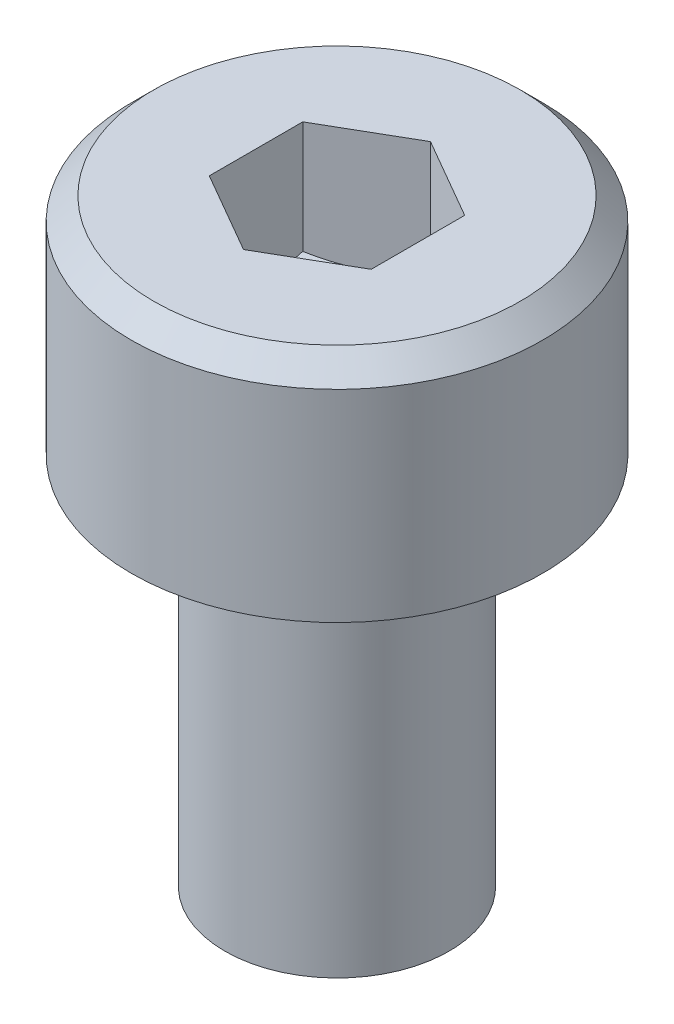
ISO-10303-21;
HEADER;
FILE_DESCRIPTION(('STEP AP214'),'2;1');
FILE_NAME('part.step','',(''),(''),'','','');
FILE_SCHEMA(('AUTOMOTIVE_DESIGN { 1 0 10303 214 1 1 1 1 }'));
ENDSEC;
DATA;
#1=APPLICATION_CONTEXT('core data for automotive mechanical design processes');
#2=APPLICATION_PROTOCOL_DEFINITION('international standard','automotive_design',2000,#1);
#3=PRODUCT_CONTEXT('',#1,'mechanical');
#4=PRODUCT('Part','Part','',(#3));
#5=PRODUCT_RELATED_PRODUCT_CATEGORY('part','',(#4));
#6=PRODUCT_DEFINITION_FORMATION('','',#4);
#7=PRODUCT_DEFINITION_CONTEXT('part definition',#1,'design');
#8=PRODUCT_DEFINITION('design','',#6,#7);
#9=PRODUCT_DEFINITION_SHAPE('','',#8);
#10=(LENGTH_UNIT() NAMED_UNIT(*) SI_UNIT(.MILLI.,.METRE.));
#11=(NAMED_UNIT(*) PLANE_ANGLE_UNIT() SI_UNIT($,.RADIAN.));
#12=(NAMED_UNIT(*) SI_UNIT($,.STERADIAN.) SOLID_ANGLE_UNIT());
#13=UNCERTAINTY_MEASURE_WITH_UNIT(LENGTH_MEASURE(1.E-05),#10,'distance_accuracy_value','');
#14=(GEOMETRIC_REPRESENTATION_CONTEXT(3) GLOBAL_UNCERTAINTY_ASSIGNED_CONTEXT((#13)) GLOBAL_UNIT_ASSIGNED_CONTEXT((#10,
#11,#12)) REPRESENTATION_CONTEXT('',''));
#15=CARTESIAN_POINT('',(0.,0.,0.));
#16=DIRECTION('',(0.,0.,1.));
#17=DIRECTION('',(1.,0.,0.));
#18=AXIS2_PLACEMENT_3D('',#15,#16,#17);
#19=CARTESIAN_POINT('',(0.,0.,0.));
#20=DIRECTION('',(0.,1.,0.));
#21=DIRECTION('',(0.,0.,1.));
#22=AXIS2_PLACEMENT_3D('',#19,#20,#21);
#23=PLANE('',#22);
#24=CARTESIAN_POINT('',(0.,0.,0.));
#25=DIRECTION('',(0.,1.,0.));
#26=DIRECTION('',(0.,0.,1.));
#27=AXIS2_PLACEMENT_3D('',#24,#25,#26);
#28=CIRCLE('',#27,2.75);
#29=CARTESIAN_POINT('',(0.,0.,2.75));
#30=VERTEX_POINT('',#29);
#31=EDGE_CURVE('E199',#30,#30,#28,.T.);
#32=ORIENTED_EDGE('',*,*,#31,.F.);
#33=EDGE_LOOP('',(#32));
#34=FACE_BOUND('',#33,.T.);
#35=CARTESIAN_POINT('',(0.,0.,0.));
#36=DIRECTION('',(0.,1.,0.));
#37=DIRECTION('',(0.,0.,1.));
#38=AXIS2_PLACEMENT_3D('',#35,#36,#37);
#39=CIRCLE('',#38,1.5);
#40=CARTESIAN_POINT('',(0.,0.,1.5));
#41=VERTEX_POINT('',#40);
#42=EDGE_CURVE('E11',#41,#41,#39,.F.);
#43=ORIENTED_EDGE('',*,*,#42,.F.);
#44=EDGE_LOOP('',(#43));
#45=FACE_BOUND('',#44,.T.);
#46=ADVANCED_FACE('F33',(#34,#45),#23,.F.);
#47=CARTESIAN_POINT('',(0.,3.,0.));
#48=DIRECTION('',(0.,1.,0.));
#49=DIRECTION('',(0.,0.,1.));
#50=AXIS2_PLACEMENT_3D('',#47,#48,#49);
#51=PLANE('',#50);
#52=CARTESIAN_POINT('',(0.,3.,0.));
#53=DIRECTION('',(0.,1.,0.));
#54=DIRECTION('',(0.,0.,1.));
#55=AXIS2_PLACEMENT_3D('',#52,#53,#54);
#56=CIRCLE('',#55,2.45);
#57=CARTESIAN_POINT('',(0.,3.,2.45));
#58=VERTEX_POINT('',#57);
#59=EDGE_CURVE('E106',#58,#58,#56,.T.);
#60=ORIENTED_EDGE('',*,*,#59,.T.);
#61=EDGE_LOOP('',(#60));
#62=FACE_BOUND('',#61,.T.);
#63=DIRECTION('',(-0.866025403784438,0.,0.500000000000001));
#64=VECTOR('',#63,1.);
#65=CARTESIAN_POINT('',(0.,3.,-1.25));
#66=LINE('',#65,#64);
#67=CARTESIAN_POINT('',(0.,3.,-1.25));
#68=VERTEX_POINT('',#67);
#69=CARTESIAN_POINT('',(-1.08253175473055,3.,-0.624999999999998));
#70=VERTEX_POINT('',#69);
#71=EDGE_CURVE('E175',#68,#70,#66,.T.);
#72=ORIENTED_EDGE('',*,*,#71,.F.);
#73=DIRECTION('',(-0.866025403784442,0.,-0.499999999999995));
#74=VECTOR('',#73,1.);
#75=CARTESIAN_POINT('',(1.08253175473054,3.,-0.625000000000013));
#76=LINE('',#75,#74);
#77=CARTESIAN_POINT('',(1.08253175473054,3.,-0.625000000000013));
#78=VERTEX_POINT('',#77);
#79=EDGE_CURVE('E173',#78,#68,#76,.T.);
#80=ORIENTED_EDGE('',*,*,#79,.F.);
#81=DIRECTION('',(0.,0.,-1.));
#82=VECTOR('',#81,1.);
#83=CARTESIAN_POINT('',(1.08253175473055,3.,0.62499999999999));
#84=LINE('',#83,#82);
#85=CARTESIAN_POINT('',(1.08253175473055,3.,0.62499999999999));
#86=VERTEX_POINT('',#85);
#87=EDGE_CURVE('E184',#86,#78,#84,.T.);
#88=ORIENTED_EDGE('',*,*,#87,.F.);
#89=DIRECTION('',(0.866025403784435,0.,-0.500000000000007));
#90=VECTOR('',#89,1.);
#91=CARTESIAN_POINT('',(0.,3.,1.25));
#92=LINE('',#91,#90);
#93=CARTESIAN_POINT('',(0.,3.,1.25));
#94=VERTEX_POINT('',#93);
#95=EDGE_CURVE('E181',#94,#86,#92,.T.);
#96=ORIENTED_EDGE('',*,*,#95,.F.);
#97=DIRECTION('',(0.866025403784441,0.,0.499999999999995));
#98=VECTOR('',#97,1.);
#99=CARTESIAN_POINT('',(-1.08253175473055,3.,0.625000000000005));
#100=LINE('',#99,#98);
#101=CARTESIAN_POINT('',(-1.08253175473055,3.,0.625000000000005));
#102=VERTEX_POINT('',#101);
#103=EDGE_CURVE('E179',#102,#94,#100,.T.);
#104=ORIENTED_EDGE('',*,*,#103,.F.);
#105=DIRECTION('',(0.,0.,1.));
#106=VECTOR('',#105,1.);
#107=CARTESIAN_POINT('',(-1.08253175473055,3.,-0.624999999999998));
#108=LINE('',#107,#106);
#109=EDGE_CURVE('E177',#70,#102,#108,.T.);
#110=ORIENTED_EDGE('',*,*,#109,.F.);
#111=EDGE_LOOP('',(#72,#80,#88,#96,#104,#110));
#112=FACE_BOUND('',#111,.T.);
#113=ADVANCED_FACE('F166',(#62,#112),#51,.T.);
#114=CARTESIAN_POINT('',(0.,3.,0.));
#115=DIRECTION('',(0.,-1.,0.));
#116=DIRECTION('',(0.,0.,-1.));
#117=AXIS2_PLACEMENT_3D('',#114,#115,#116);
#118=CYLINDRICAL_SURFACE('',#117,2.75);
#119=CARTESIAN_POINT('',(0.,2.7,0.));
#120=DIRECTION('',(0.,1.,0.));
#121=DIRECTION('',(0.,0.,1.));
#122=AXIS2_PLACEMENT_3D('',#119,#120,#121);
#123=CIRCLE('',#122,2.75);
#124=CARTESIAN_POINT('',(0.,2.7,2.75));
#125=VERTEX_POINT('',#124);
#126=EDGE_CURVE('E104',#125,#125,#123,.F.);
#127=ORIENTED_EDGE('',*,*,#126,.T.);
#128=EDGE_LOOP('',(#127));
#129=FACE_BOUND('',#128,.T.);
#130=ORIENTED_EDGE('',*,*,#31,.T.);
#131=EDGE_LOOP('',(#130));
#132=FACE_BOUND('',#131,.T.);
#133=ADVANCED_FACE('F164',(#129,#132),#118,.T.);
#134=CARTESIAN_POINT('',(1.08253175473054,3.,-0.625000000000013));
#135=DIRECTION('',(-0.499999999999995,0.,0.866025403784441));
#136=DIRECTION('',(0.866025403784442,0.,0.499999999999995));
#137=AXIS2_PLACEMENT_3D('',#134,#135,#136);
#138=PLANE('',#137);
#139=CARTESIAN_POINT('',(1.08273175473054,1.50006667590342,-0.624884529946175));
#140=CARTESIAN_POINT('',(1.03515766458485,1.48419969883568,-0.652351443698243));
#141=CARTESIAN_POINT('',(0.987172923048572,1.46976867734377,-0.680055447141205));
#142=CARTESIAN_POINT('',(0.890372341195807,1.4445778432912,-0.73594328913161));
#143=CARTESIAN_POINT('',(0.841554779441903,1.43382694464009,-0.764128121551408));
#144=CARTESIAN_POINT('',(0.744524728912284,1.41708976958857,-0.820148447344165));
#145=CARTESIAN_POINT('',(0.696327179016163,1.41099212955573,-0.847975315750971));
#146=CARTESIAN_POINT('',(0.599705015442131,1.4037096412981,-0.903760147900121));
#147=CARTESIAN_POINT('',(0.551280753523415,1.40251876590461,-0.9317179085542));
#148=CARTESIAN_POINT('',(0.460778854483859,1.40498149929693,-0.98396920432686));
#149=CARTESIAN_POINT('',(0.418687745987484,1.40803041906954,-1.00827051714773));
#150=CARTESIAN_POINT('',(0.33477978362905,1.41769827479339,-1.05671480180253));
#151=CARTESIAN_POINT('',(0.292963220509233,1.42432052094983,-1.08085760577634));
#152=CARTESIAN_POINT('',(0.208881919120999,1.44087742167282,-1.12940196776665));
#153=CARTESIAN_POINT('',(0.16662783573654,1.45088233834795,-1.15379737418302));
#154=CARTESIAN_POINT('',(0.0827502828402637,1.47359025454659,-1.20222410192666));
#155=CARTESIAN_POINT('',(0.0411257367254728,1.48628791017462,-1.22625604483093));
#156=CARTESIAN_POINT('',(-0.000199999999999905,1.50006667590342,-1.25011547005384));
#157=B_SPLINE_CURVE_WITH_KNOTS('',3,(#139,#140,#141,#142,#143,#144,#145,#146,#147,#148,#149,
#150,#151,#152,#153,#154,#155,#156),.UNSPECIFIED.,.F.,.F.,(4,2,2,2,2,2,2,2,4),(0.,
0.171605763716155,0.343624293550985,0.511384355635629,0.678938290005964,0.824893722874594,
0.970984596482971,1.12031822040934,1.26935821111451),.UNSPECIFIED.);
#158=CARTESIAN_POINT('',(1.08253175473054,1.5,-0.625000000000012));
#159=VERTEX_POINT('',#158);
#160=CARTESIAN_POINT('',(0.,1.50000000000001,-1.25));
#161=VERTEX_POINT('',#160);
#162=EDGE_CURVE('E99',#159,#161,#157,.T.);
#163=ORIENTED_EDGE('',*,*,#162,.F.);
#164=DIRECTION('',(0.,-1.,0.));
#165=VECTOR('',#164,1.);
#166=CARTESIAN_POINT('',(1.08253175473054,3.,-0.625000000000013));
#167=LINE('',#166,#165);
#168=EDGE_CURVE('E186',#78,#159,#167,.T.);
#169=ORIENTED_EDGE('',*,*,#168,.F.);
#170=ORIENTED_EDGE('',*,*,#79,.T.);
#171=DIRECTION('',(0.,-1.,0.));
#172=VECTOR('',#171,1.);
#173=CARTESIAN_POINT('',(0.,3.,-1.25));
#174=LINE('',#173,#172);
#175=EDGE_CURVE('E197',#68,#161,#174,.T.);
#176=ORIENTED_EDGE('',*,*,#175,.T.);
#177=EDGE_LOOP('',(#163,#169,#170,#176));
#178=FACE_BOUND('',#177,.T.);
#179=ADVANCED_FACE('F160',(#178),#138,.T.);
#180=CARTESIAN_POINT('',(0.,3.,-1.25));
#181=DIRECTION('',(0.500000000000001,0.,0.866025403784438));
#182=DIRECTION('',(0.866025403784438,0.,-0.500000000000001));
#183=AXIS2_PLACEMENT_3D('',#180,#181,#182);
#184=PLANE('',#183);
#185=CARTESIAN_POINT('',(0.000199999999999962,1.50006667590342,-1.25011547005384));
#186=CARTESIAN_POINT('',(-0.0473740901456956,1.48419969883569,-1.22264855630177));
#187=CARTESIAN_POINT('',(-0.0953588316819688,1.46976867734377,-1.19494455285881));
#188=CARTESIAN_POINT('',(-0.192159413534733,1.4445778432912,-1.1390567108684));
#189=CARTESIAN_POINT('',(-0.240976975288638,1.4338269446401,-1.1108718784486));
#190=CARTESIAN_POINT('',(-0.338007025818256,1.41708976958857,-1.05485155265584));
#191=CARTESIAN_POINT('',(-0.386204575714378,1.41099212955573,-1.02702468424904));
#192=CARTESIAN_POINT('',(-0.482826739288409,1.40370964129811,-0.971239852099887));
#193=CARTESIAN_POINT('',(-0.531251001207125,1.40251876590462,-0.943282091445807));
#194=CARTESIAN_POINT('',(-0.621752900246681,1.40498149929693,-0.891030795673147));
#195=CARTESIAN_POINT('',(-0.663844008743058,1.40803041906954,-0.866729482852274));
#196=CARTESIAN_POINT('',(-0.747751971101493,1.41769827479339,-0.818285198197478));
#197=CARTESIAN_POINT('',(-0.789568534221311,1.42432052094984,-0.794142394223667));
#198=CARTESIAN_POINT('',(-0.873649835609546,1.44087742167282,-0.745598032233355));
#199=CARTESIAN_POINT('',(-0.915903918994006,1.45088233834796,-0.721202625816976));
#200=CARTESIAN_POINT('',(-0.999781471890284,1.47359025454659,-0.672775898073342));
#201=CARTESIAN_POINT('',(-1.04140601800508,1.48628791017462,-0.648743955169071));
#202=CARTESIAN_POINT('',(-1.08273175473055,1.50006667590343,-0.62488452994616));
#203=B_SPLINE_CURVE_WITH_KNOTS('',3,(#185,#186,#187,#188,#189,#190,#191,#192,#193,#194,#195,
#196,#197,#198,#199,#200,#201,#202),.UNSPECIFIED.,.F.,.F.,(4,2,2,2,2,2,2,2,4),(0.,
0.171605763716156,0.343624293550986,0.511384355635631,0.678938290005966,0.824893722874599,
0.97098459648298,1.12031822040935,1.26935821111453),.UNSPECIFIED.);
#204=CARTESIAN_POINT('',(-1.08253175473055,1.50000000000001,-0.624999999999998));
#205=VERTEX_POINT('',#204);
#206=EDGE_CURVE('E48',#161,#205,#203,.T.);
#207=ORIENTED_EDGE('',*,*,#206,.F.);
#208=ORIENTED_EDGE('',*,*,#175,.F.);
#209=ORIENTED_EDGE('',*,*,#71,.T.);
#210=DIRECTION('',(0.,-1.,0.));
#211=VECTOR('',#210,1.);
#212=CARTESIAN_POINT('',(-1.08253175473055,3.,-0.624999999999998));
#213=LINE('',#212,#211);
#214=EDGE_CURVE('E195',#70,#205,#213,.T.);
#215=ORIENTED_EDGE('',*,*,#214,.T.);
#216=EDGE_LOOP('',(#207,#208,#209,#215));
#217=FACE_BOUND('',#216,.T.);
#218=ADVANCED_FACE('F156',(#217),#184,.T.);
#219=CARTESIAN_POINT('',(-1.08253175473055,3.,-0.624999999999998));
#220=DIRECTION('',(1.,0.,0.));
#221=DIRECTION('',(0.,0.,-1.));
#222=AXIS2_PLACEMENT_3D('',#219,#220,#221);
#223=PLANE('',#222);
#224=CARTESIAN_POINT('',(-1.08253175473055,1.90252350786926,-1.61854207246461));
#225=CARTESIAN_POINT('',(-1.08253175473055,1.88009544131824,-1.57179464085444));
#226=CARTESIAN_POINT('',(-1.08253175473055,1.85790094000288,-1.52493329892675));
#227=CARTESIAN_POINT('',(-1.08253175473055,1.81410999015528,-1.43092215197583));
#228=CARTESIAN_POINT('',(-1.08253175473055,1.79251364925216,-1.38377229687903));
#229=CARTESIAN_POINT('',(-1.08253175473055,1.74992928980642,-1.28885313779535));
#230=CARTESIAN_POINT('',(-1.08253175473055,1.72894575604473,-1.24108181117268));
#231=CARTESIAN_POINT('',(-1.08253175473055,1.68792455230513,-1.14513807265409));
#232=CARTESIAN_POINT('',(-1.08253175473055,1.66788683314613,-1.09696568176655));
#233=CARTESIAN_POINT('',(-1.08253175473055,1.60851588060937,-0.949204485361103));
#234=CARTESIAN_POINT('',(-1.08253175473055,1.57106281672989,-0.848845236643131));
#235=CARTESIAN_POINT('',(-1.08253175473055,1.5044105529158,-0.645546768971506));
#236=CARTESIAN_POINT('',(-1.08253175473055,1.47518992457583,-0.5426150217241));
#237=CARTESIAN_POINT('',(-1.08253175473055,1.44130046861876,-0.386139180919494));
#238=CARTESIAN_POINT('',(-1.08253175473055,1.4316652692718,-0.333684130872886));
#239=CARTESIAN_POINT('',(-1.08253175473055,1.41636624946538,-0.228185609990205));
#240=CARTESIAN_POINT('',(-1.08253175473055,1.41070216063044,-0.175142179164228));
#241=CARTESIAN_POINT('',(-1.08253175473055,1.40387007607295,-0.0693968587056928));
#242=CARTESIAN_POINT('',(-1.08253175473055,1.40264902325599,-0.0166984916759359));
#243=CARTESIAN_POINT('',(-1.08253175473055,1.40466463647557,0.0886110877016726));
#244=CARTESIAN_POINT('',(-1.08253175473055,1.40790157853585,0.141222294450917));
#245=CARTESIAN_POINT('',(-1.08253175473055,1.42110336503279,0.271032685537224));
#246=CARTESIAN_POINT('',(-1.08253175473055,1.43354225882011,0.347980337358009));
#247=CARTESIAN_POINT('',(-1.08253175473055,1.46561869386202,0.500379188409627));
#248=CARTESIAN_POINT('',(-1.08253175473055,1.48526491121432,0.575828468041697));
#249=CARTESIAN_POINT('',(-1.08253175473054,1.51882512576911,0.688671442644939));
#250=CARTESIAN_POINT('',(-1.08253175473054,1.53085020008398,0.726648298182656));
#251=CARTESIAN_POINT('',(-1.08253175473054,1.55601332526106,0.802206178821472));
#252=CARTESIAN_POINT('',(-1.08253175473054,1.56915068154238,0.839787434712231));
#253=CARTESIAN_POINT('',(-1.08253175473054,1.60994146726917,0.952015424139686));
#254=CARTESIAN_POINT('',(-1.08253175473054,1.63897715411134,1.02615785086023));
#255=CARTESIAN_POINT('',(-1.08253175473054,1.71656734651969,1.21475992203258));
#256=CARTESIAN_POINT('',(-1.08253175473054,1.76692297933719,1.32846794126584));
#257=CARTESIAN_POINT('',(-1.08253175473054,1.87117425805083,1.55425445584888));
#258=CARTESIAN_POINT('',(-1.08253175473054,1.92507081201544,1.66633252412685));
#259=CARTESIAN_POINT('',(-1.08253175473054,2.03513914727263,1.88953187968015));
#260=CARTESIAN_POINT('',(-1.08253175473054,2.09131364415462,2.00065182135724));
#261=CARTESIAN_POINT('',(-1.08253175473054,2.20510311911809,2.22213017446064));
#262=CARTESIAN_POINT('',(-1.08253175473054,2.2627179140965,2.33248868043392));
#263=CARTESIAN_POINT('',(-1.08253175473054,2.37345842581076,2.54228730867523));
#264=CARTESIAN_POINT('',(-1.08253175473054,2.42649457284346,2.64177481780018));
#265=CARTESIAN_POINT('',(-1.08253175473054,2.53317091864402,2.84042980269941));
#266=CARTESIAN_POINT('',(-1.08253175473054,2.58681113976642,2.93959726645413));
#267=CARTESIAN_POINT('',(-1.08253175473054,2.69440737306942,3.13743371392053));
#268=CARTESIAN_POINT('',(-1.08253175473054,2.74836223499422,3.23610332396277));
#269=CARTESIAN_POINT('',(-1.08253175473053,2.85662312522996,3.43324305841481));
#270=CARTESIAN_POINT('',(-1.08253175473053,2.91092913501566,3.53171319299399));
#271=CARTESIAN_POINT('',(-1.08253175473053,2.96536388196108,3.63011165909539));
#272=B_SPLINE_CURVE_WITH_KNOTS('',3,(#224,#225,#226,#227,#228,#229,#230,#231,#232,#233,#234,
#235,#236,#237,#238,#239,#240,#241,#242,#243,#244,#245,#246,#247,#248,#249,#250,#251,#252,#253,
#254,#255,#256,#257,#258,#259,#260,#261,#262,#263,#264,#265,#266,#267,#268,#269,#270,#271),
.UNSPECIFIED.,.F.,.F.,(4,2,2,2,2,2,2,2,2,2,2,2,2,2,2,2,2,2,2,2,2,2,2,4),(0.,0.155549357752409,
0.311126524581653,0.467647428018342,0.624160183591729,0.945346442146275,1.26568878601192,
1.42556175036804,1.5854239091523,1.74337066955758,1.90132720992359,2.13468710797687,
2.36832884889941,2.48782113055145,2.60723933620812,2.8460397787221,3.21900420758858,
3.59206465930033,3.96558373159632,4.33905555802568,4.67727675927078,5.01551051822605,
5.35288396719669,5.69023976052412),.UNSPECIFIED.);
#273=CARTESIAN_POINT('',(-1.08253175473055,1.50000000000001,0.625000000000005));
#274=VERTEX_POINT('',#273);
#275=EDGE_CURVE('E56',#205,#274,#272,.T.);
#276=ORIENTED_EDGE('',*,*,#275,.F.);
#277=ORIENTED_EDGE('',*,*,#214,.F.);
#278=ORIENTED_EDGE('',*,*,#109,.T.);
#279=DIRECTION('',(0.,-1.,0.));
#280=VECTOR('',#279,1.);
#281=CARTESIAN_POINT('',(-1.08253175473055,3.,0.625000000000005));
#282=LINE('',#281,#280);
#283=EDGE_CURVE('E193',#102,#274,#282,.T.);
#284=ORIENTED_EDGE('',*,*,#283,.T.);
#285=EDGE_LOOP('',(#276,#277,#278,#284));
#286=FACE_BOUND('',#285,.T.);
#287=ADVANCED_FACE('F153',(#286),#223,.T.);
#288=CARTESIAN_POINT('',(-1.08253175473055,3.,0.625000000000005));
#289=DIRECTION('',(0.499999999999995,0.,-0.866025403784441));
#290=DIRECTION('',(-0.866025403784441,0.,-0.499999999999995));
#291=AXIS2_PLACEMENT_3D('',#288,#289,#290);
#292=PLANE('',#291);
#293=CARTESIAN_POINT('',(-1.08273175473055,1.50006667590343,0.624884529946167));
#294=CARTESIAN_POINT('',(-1.03515766458485,1.48419969883569,0.652351443698236));
#295=CARTESIAN_POINT('',(-0.987172923048576,1.46976867734378,0.680055447141197));
#296=CARTESIAN_POINT('',(-0.890372341195811,1.44457784329121,0.735943289131603));
#297=CARTESIAN_POINT('',(-0.841554779441906,1.4338269446401,0.7641281215514));
#298=CARTESIAN_POINT('',(-0.744524728912287,1.41708976958858,0.820148447344158));
#299=CARTESIAN_POINT('',(-0.696327179016165,1.41099212955574,0.847975315750964));
#300=CARTESIAN_POINT('',(-0.599705015442133,1.40370964129811,0.903760147900115));
#301=CARTESIAN_POINT('',(-0.551280753523417,1.40251876590462,0.931717908554194));
#302=CARTESIAN_POINT('',(-0.460778854483861,1.40498149929693,0.983969204326854));
#303=CARTESIAN_POINT('',(-0.418687745987484,1.40803041906954,1.00827051714773));
#304=CARTESIAN_POINT('',(-0.334779783629048,1.41769827479339,1.05671480180252));
#305=CARTESIAN_POINT('',(-0.29296322050923,1.42432052094984,1.08085760577633));
#306=CARTESIAN_POINT('',(-0.208881919120995,1.44087742167282,1.12940196776664));
#307=CARTESIAN_POINT('',(-0.166627835736535,1.45088233834795,1.15379737418302));
#308=CARTESIAN_POINT('',(-0.0827502828402566,1.47359025454659,1.20222410192666));
#309=CARTESIAN_POINT('',(-0.0411257367254648,1.48628791017462,1.22625604483093));
#310=CARTESIAN_POINT('',(0.000200000000008754,1.50006667590342,1.25011547005384));
#311=B_SPLINE_CURVE_WITH_KNOTS('',3,(#293,#294,#295,#296,#297,#298,#299,#300,#301,#302,#303,
#304,#305,#306,#307,#308,#309,#310),.UNSPECIFIED.,.F.,.F.,(4,2,2,2,2,2,2,2,4),(0.,
0.171605763716156,0.343624293550988,0.511384355635632,0.678938290005968,0.8248937228746,
0.970984596482981,1.12031822040935,1.26935821111453),.UNSPECIFIED.);
#312=CARTESIAN_POINT('',(0.,1.5,1.25));
#313=VERTEX_POINT('',#312);
#314=EDGE_CURVE('E135',#274,#313,#311,.T.);
#315=ORIENTED_EDGE('',*,*,#314,.F.);
#316=ORIENTED_EDGE('',*,*,#283,.F.);
#317=ORIENTED_EDGE('',*,*,#103,.T.);
#318=DIRECTION('',(0.,-1.,0.));
#319=VECTOR('',#318,1.);
#320=CARTESIAN_POINT('',(0.,3.,1.25));
#321=LINE('',#320,#319);
#322=EDGE_CURVE('E190',#94,#313,#321,.T.);
#323=ORIENTED_EDGE('',*,*,#322,.T.);
#324=EDGE_LOOP('',(#315,#316,#317,#323));
#325=FACE_BOUND('',#324,.T.);
#326=ADVANCED_FACE('F124',(#325),#292,.T.);
#327=CARTESIAN_POINT('',(0.,3.,1.25));
#328=DIRECTION('',(-0.500000000000007,0.,-0.866025403784435));
#329=DIRECTION('',(-0.866025403784435,0.,0.500000000000007));
#330=AXIS2_PLACEMENT_3D('',#327,#328,#329);
#331=PLANE('',#330);
#332=CARTESIAN_POINT('',(-0.000199999999991232,1.50006667590342,1.25011547005384));
#333=CARTESIAN_POINT('',(0.0473740901457039,1.48419969883569,1.22264855630177));
#334=CARTESIAN_POINT('',(0.0953588316819768,1.46976867734377,1.19494455285881));
#335=CARTESIAN_POINT('',(0.192159413534741,1.4445778432912,1.1390567108684));
#336=CARTESIAN_POINT('',(0.240976975288645,1.4338269446401,1.1108718784486));
#337=CARTESIAN_POINT('',(0.338007025818263,1.41708976958857,1.05485155265584));
#338=CARTESIAN_POINT('',(0.386204575714384,1.41099212955573,1.02702468424904));
#339=CARTESIAN_POINT('',(0.482826739288415,1.4037096412981,0.971239852099884));
#340=CARTESIAN_POINT('',(0.53125100120713,1.40251876590461,0.943282091445804));
#341=CARTESIAN_POINT('',(0.621752900246687,1.40498149929693,0.891030795673143));
#342=CARTESIAN_POINT('',(0.663844008743063,1.40803041906953,0.86672948285227));
#343=CARTESIAN_POINT('',(0.747751971101498,1.41769827479339,0.818285198197474));
#344=CARTESIAN_POINT('',(0.789568534221316,1.42432052094983,0.794142394223661));
#345=CARTESIAN_POINT('',(0.873649835609551,1.44087742167282,0.745598032233349));
#346=CARTESIAN_POINT('',(0.915903918994011,1.45088233834795,0.72120262581697));
#347=CARTESIAN_POINT('',(0.999781471890289,1.47359025454658,0.672775898073336));
#348=CARTESIAN_POINT('',(1.04140601800508,1.48628791017461,0.648743955169064));
#349=CARTESIAN_POINT('',(1.08273175473055,1.50006667590342,0.624884529946152));
#350=B_SPLINE_CURVE_WITH_KNOTS('',3,(#332,#333,#334,#335,#336,#337,#338,#339,#340,#341,#342,
#343,#344,#345,#346,#347,#348,#349),.UNSPECIFIED.,.F.,.F.,(4,2,2,2,2,2,2,2,4),(0.,
0.171605763716155,0.343624293550986,0.51138435563563,0.678938290005966,0.824893722874599,
0.97098459648298,1.12031822040935,1.26935821111453),.UNSPECIFIED.);
#351=CARTESIAN_POINT('',(1.08253175473055,1.5,0.62499999999999));
#352=VERTEX_POINT('',#351);
#353=EDGE_CURVE('E101',#313,#352,#350,.T.);
#354=ORIENTED_EDGE('',*,*,#353,.F.);
#355=ORIENTED_EDGE('',*,*,#322,.F.);
#356=ORIENTED_EDGE('',*,*,#95,.T.);
#357=DIRECTION('',(0.,-1.,0.));
#358=VECTOR('',#357,1.);
#359=CARTESIAN_POINT('',(1.08253175473055,3.,0.62499999999999));
#360=LINE('',#359,#358);
#361=EDGE_CURVE('E188',#86,#352,#360,.T.);
#362=ORIENTED_EDGE('',*,*,#361,.T.);
#363=EDGE_LOOP('',(#354,#355,#356,#362));
#364=FACE_BOUND('',#363,.T.);
#365=ADVANCED_FACE('F120',(#364),#331,.T.);
#366=CARTESIAN_POINT('',(1.08253175473055,3.,0.62499999999999));
#367=DIRECTION('',(-1.,0.,0.));
#368=DIRECTION('',(0.,0.,1.));
#369=AXIS2_PLACEMENT_3D('',#366,#367,#368);
#370=PLANE('',#369);
#371=CARTESIAN_POINT('',(1.08253175473053,1.90252350758987,-1.61854207188248));
#372=CARTESIAN_POINT('',(1.08253175473053,1.8800954410509,-1.5717946402922));
#373=CARTESIAN_POINT('',(1.08253175473053,1.85790093974756,-1.52493329838442));
#374=CARTESIAN_POINT('',(1.08253175473053,1.81410998992395,-1.4309221514734));
#375=CARTESIAN_POINT('',(1.08253175473053,1.79251364903279,-1.38377229639658));
#376=CARTESIAN_POINT('',(1.08253175473053,1.74992928961099,-1.28885313735325));
#377=CARTESIAN_POINT('',(1.08253175473053,1.72894575586127,-1.24108181075094));
#378=CARTESIAN_POINT('',(1.08253175473054,1.68792455214538,-1.14513807227324));
#379=CARTESIAN_POINT('',(1.08253175473054,1.66788683299812,-1.09696568140623));
#380=CARTESIAN_POINT('',(1.08253175473054,1.60851588049694,-0.949204485064613));
#381=CARTESIAN_POINT('',(1.08253175473054,1.57106281664067,-0.848845236390331));
#382=CARTESIAN_POINT('',(1.08253175473054,1.50441055286846,-0.64554676880802));
#383=CARTESIAN_POINT('',(1.08253175473054,1.47518992454717,-0.542615021606229));
#384=CARTESIAN_POINT('',(1.08253175473054,1.44130046861145,-0.386139180878671));
#385=CARTESIAN_POINT('',(1.08253175473054,1.43166526927081,-0.333684130862514));
#386=CARTESIAN_POINT('',(1.08253175473055,1.41636624947227,-0.228185610041376));
#387=CARTESIAN_POINT('',(1.08253175473055,1.4107021606389,-0.17514217924649));
#388=CARTESIAN_POINT('',(1.08253175473055,1.40387007607912,-0.0693968588495582));
#389=CARTESIAN_POINT('',(1.08253175473055,1.40264902325837,-0.016698491850311));
#390=CARTESIAN_POINT('',(1.08253175473055,1.40466463646533,0.0886110874668518));
#391=CARTESIAN_POINT('',(1.08253175473055,1.40790157851676,0.14122229418616));
#392=CARTESIAN_POINT('',(1.08253175473055,1.42110336498935,0.271032685223806));
#393=CARTESIAN_POINT('',(1.08253175473055,1.43354225876168,0.34798033702621));
#394=CARTESIAN_POINT('',(1.08253175473055,1.46561869377316,0.500379188042237));
#395=CARTESIAN_POINT('',(1.08253175473055,1.48526491111002,0.575828467657099));
#396=CARTESIAN_POINT('',(1.08253175473055,1.51882512564192,0.688671442234549));
#397=CARTESIAN_POINT('',(1.08253175473056,1.53085019994909,0.726648297763501));
#398=CARTESIAN_POINT('',(1.08253175473056,1.55601332511095,0.802206178384873));
#399=CARTESIAN_POINT('',(1.08253175473056,1.56915068138477,0.839787434266954));
#400=CARTESIAN_POINT('',(1.08253175473056,1.60994146708938,0.952015423668438));
#401=CARTESIAN_POINT('',(1.08253175473056,1.6389771539172,1.02615785037173));
#402=CARTESIAN_POINT('',(1.08253175473056,1.71656734630325,1.21475992153263));
#403=CARTESIAN_POINT('',(1.08253175473056,1.76692297911509,1.32846794077091));
#404=CARTESIAN_POINT('',(1.08253175473056,1.87117425782012,1.55425445536295));
#405=CARTESIAN_POINT('',(1.08253175473057,1.92507081178178,1.66633252364491));
#406=CARTESIAN_POINT('',(1.08253175473057,2.03513914703465,1.88953187920569));
#407=CARTESIAN_POINT('',(1.08253175473057,2.09131364391528,2.00065182088628));
#408=CARTESIAN_POINT('',(1.08253175473057,2.20510311887687,2.22213017399623));
#409=CARTESIAN_POINT('',(1.08253175473057,2.26271791385477,2.33248867997256));
#410=CARTESIAN_POINT('',(1.08253175473057,2.37345842556709,2.54228730821665));
#411=CARTESIAN_POINT('',(1.08253175473058,2.42649457259828,2.64177481734137));
#412=CARTESIAN_POINT('',(1.08253175473058,2.53317091839611,2.84042980223999));
#413=CARTESIAN_POINT('',(1.08253175473058,2.58681113951727,2.93959726599434));
#414=CARTESIAN_POINT('',(1.08253175473058,2.6944073728178,3.13743371345957));
#415=CARTESIAN_POINT('',(1.08253175473058,2.74836223474137,3.23610332350101));
#416=CARTESIAN_POINT('',(1.08253175473058,2.85662312497475,3.43324305795137));
#417=CARTESIAN_POINT('',(1.08253175473058,2.91092913475934,3.53171319252968));
#418=CARTESIAN_POINT('',(1.08253175473059,2.96536388170369,3.63011165863018));
#419=B_SPLINE_CURVE_WITH_KNOTS('',3,(#371,#372,#373,#374,#375,#376,#377,#378,#379,#380,#381,
#382,#383,#384,#385,#386,#387,#388,#389,#390,#391,#392,#393,#394,#395,#396,#397,#398,#399,#400,
#401,#402,#403,#404,#405,#406,#407,#408,#409,#410,#411,#412,#413,#414,#415,#416,#417,#418),
.UNSPECIFIED.,.F.,.F.,(4,2,2,2,2,2,2,2,2,2,2,2,2,2,2,2,2,2,2,2,2,2,2,4),(0.,0.15554935768298,
0.311126524442782,0.467647427809088,0.6241601833121,0.945346441719528,1.26568878543887,
1.42556174970194,1.58542390839327,1.74337066870765,1.90132720898268,2.13468710697441,
2.36832884783523,2.48782112945522,2.60723933507988,2.84603977752992,3.21900420640309,
3.59206465812173,3.96558373042522,4.33905555686199,4.67727675810433,5.01551051705687,
5.35288396602363,5.69023975934713),.UNSPECIFIED.);
#420=EDGE_CURVE('E41',#352,#159,#419,.F.);
#421=ORIENTED_EDGE('',*,*,#420,.F.);
#422=ORIENTED_EDGE('',*,*,#361,.F.);
#423=ORIENTED_EDGE('',*,*,#87,.T.);
#424=ORIENTED_EDGE('',*,*,#168,.T.);
#425=EDGE_LOOP('',(#421,#422,#423,#424));
#426=FACE_BOUND('',#425,.T.);
#427=ADVANCED_FACE('F116',(#426),#370,.T.);
#428=CARTESIAN_POINT('',(0.,3.,0.));
#429=DIRECTION('',(0.,-1.,0.));
#430=DIRECTION('',(0.,0.,-1.));
#431=AXIS2_PLACEMENT_3D('',#428,#429,#430);
#432=CONICAL_SURFACE('',#431,2.45,0.785398163397448);
#433=ORIENTED_EDGE('',*,*,#126,.F.);
#434=EDGE_LOOP('',(#433));
#435=FACE_BOUND('',#434,.T.);
#436=ORIENTED_EDGE('',*,*,#59,.F.);
#437=EDGE_LOOP('',(#436));
#438=FACE_BOUND('',#437,.T.);
#439=ADVANCED_FACE('F35',(#435,#438),#432,.T.);
#440=CARTESIAN_POINT('',(0.,1.5,0.));
#441=DIRECTION('',(0.,1.,0.));
#442=DIRECTION('',(-1.,0.,0.));
#443=AXIS2_PLACEMENT_3D('',#440,#441,#442);
#444=CONICAL_SURFACE('',#443,1.25,1.0471975511966);
#445=CARTESIAN_POINT('',(0.,0.778312163512972,0.));
#446=VERTEX_POINT('',#445);
#447=VERTEX_LOOP('',#446);
#448=FACE_BOUND('',#447,.T.);
#449=ORIENTED_EDGE('',*,*,#420,.T.);
#450=ORIENTED_EDGE('',*,*,#162,.T.);
#451=ORIENTED_EDGE('',*,*,#206,.T.);
#452=ORIENTED_EDGE('',*,*,#275,.T.);
#453=ORIENTED_EDGE('',*,*,#314,.T.);
#454=ORIENTED_EDGE('',*,*,#353,.T.);
#455=EDGE_LOOP('',(#449,#450,#451,#452,#453,#454));
#456=FACE_BOUND('',#455,.T.);
#457=ADVANCED_FACE('F90',(#448,#456),#444,.F.);
#458=CARTESIAN_POINT('',(0.,-5.,0.));
#459=DIRECTION('',(0.,1.,0.));
#460=DIRECTION('',(0.,0.,1.));
#461=AXIS2_PLACEMENT_3D('',#458,#459,#460);
#462=CYLINDRICAL_SURFACE('',#461,1.5);
#463=CARTESIAN_POINT('',(0.,-5.,0.));
#464=DIRECTION('',(0.,-1.,0.));
#465=DIRECTION('',(0.,0.,-1.));
#466=AXIS2_PLACEMENT_3D('',#463,#464,#465);
#467=CIRCLE('',#466,1.5);
#468=CARTESIAN_POINT('',(0.,-5.,-1.5));
#469=VERTEX_POINT('',#468);
#470=EDGE_CURVE('E136',#469,#469,#467,.T.);
#471=ORIENTED_EDGE('',*,*,#470,.F.);
#472=EDGE_LOOP('',(#471));
#473=FACE_BOUND('',#472,.T.);
#474=ORIENTED_EDGE('',*,*,#42,.T.);
#475=EDGE_LOOP('',(#474));
#476=FACE_BOUND('',#475,.T.);
#477=ADVANCED_FACE('F93',(#473,#476),#462,.T.);
#478=CARTESIAN_POINT('',(0.,-5.,0.));
#479=DIRECTION('',(0.,-1.,0.));
#480=DIRECTION('',(0.,0.,-1.));
#481=AXIS2_PLACEMENT_3D('',#478,#479,#480);
#482=PLANE('',#481);
#483=ORIENTED_EDGE('',*,*,#470,.T.);
#484=EDGE_LOOP('',(#483));
#485=FACE_BOUND('',#484,.T.);
#486=ADVANCED_FACE('F272',(#485),#482,.T.);
#487=CLOSED_SHELL('',(#46,#113,#133,#179,#218,#287,#326,#365,#427,#439,#457,#477,#486));
#488=MANIFOLD_SOLID_BREP('B2',#487);
#489=ADVANCED_BREP_SHAPE_REPRESENTATION('',(#18,#488),#14);
#490=SHAPE_DEFINITION_REPRESENTATION(#9,#489);
ENDSEC;
END-ISO-10303-21;
